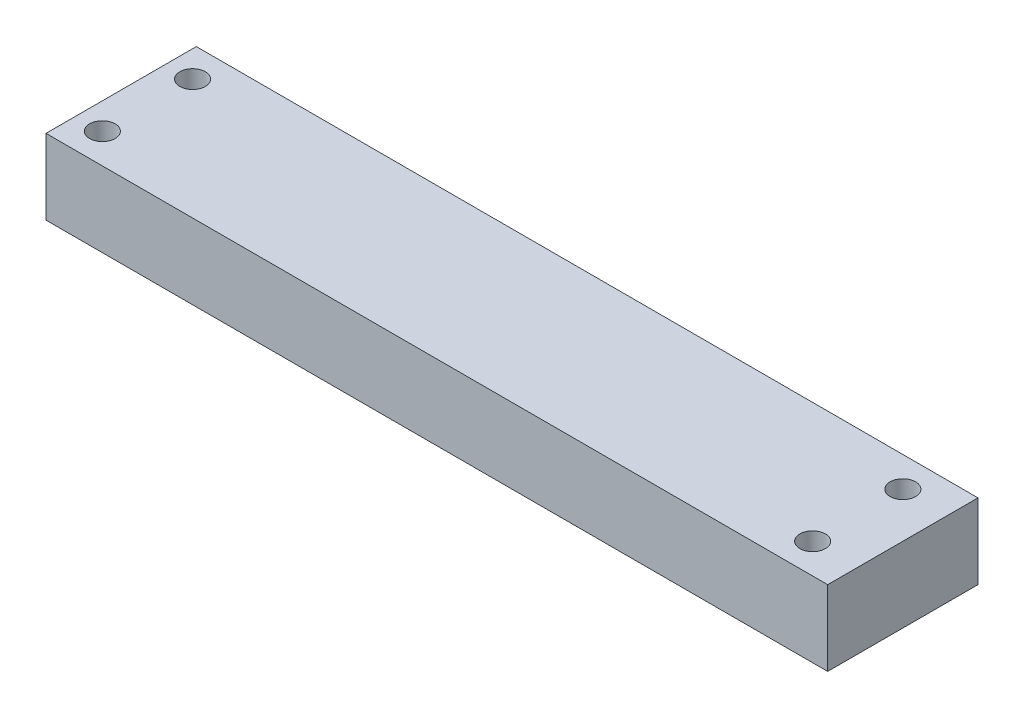
ISO-10303-21;
HEADER;
FILE_DESCRIPTION(('STEP AP214'),'2;1');
FILE_NAME('part.step','',(''),(''),'','','');
FILE_SCHEMA(('AUTOMOTIVE_DESIGN { 1 0 10303 214 1 1 1 1 }'));
ENDSEC;
DATA;
#1=APPLICATION_CONTEXT('core data for automotive mechanical design processes');
#2=APPLICATION_PROTOCOL_DEFINITION('international standard','automotive_design',2000,#1);
#3=PRODUCT_CONTEXT('',#1,'mechanical');
#4=PRODUCT('Part','Part','',(#3));
#5=PRODUCT_RELATED_PRODUCT_CATEGORY('part','',(#4));
#6=PRODUCT_DEFINITION_FORMATION('','',#4);
#7=PRODUCT_DEFINITION_CONTEXT('part definition',#1,'design');
#8=PRODUCT_DEFINITION('design','',#6,#7);
#9=PRODUCT_DEFINITION_SHAPE('','',#8);
#10=(LENGTH_UNIT() NAMED_UNIT(*) SI_UNIT(.MILLI.,.METRE.));
#11=(NAMED_UNIT(*) PLANE_ANGLE_UNIT() SI_UNIT($,.RADIAN.));
#12=(NAMED_UNIT(*) SI_UNIT($,.STERADIAN.) SOLID_ANGLE_UNIT());
#13=UNCERTAINTY_MEASURE_WITH_UNIT(LENGTH_MEASURE(1.E-05),#10,'distance_accuracy_value','');
#14=(GEOMETRIC_REPRESENTATION_CONTEXT(3) GLOBAL_UNCERTAINTY_ASSIGNED_CONTEXT((#13)) GLOBAL_UNIT_ASSIGNED_CONTEXT((#10,
#11,#12)) REPRESENTATION_CONTEXT('',''));
#15=CARTESIAN_POINT('',(0.,0.,0.));
#16=DIRECTION('',(0.,0.,1.));
#17=DIRECTION('',(1.,0.,0.));
#18=AXIS2_PLACEMENT_3D('',#15,#16,#17);
#19=CARTESIAN_POINT('',(-52.,5.,10.));
#20=DIRECTION('',(1.,0.,0.));
#21=DIRECTION('',(0.,0.,-1.));
#22=AXIS2_PLACEMENT_3D('',#19,#20,#21);
#23=PLANE('',#22);
#24=DIRECTION('',(0.,-1.,0.));
#25=VECTOR('',#24,1.);
#26=CARTESIAN_POINT('',(-52.,5.,-10.));
#27=LINE('',#26,#25);
#28=CARTESIAN_POINT('',(-52.,5.,-10.));
#29=VERTEX_POINT('',#28);
#30=CARTESIAN_POINT('',(-52.,-5.,-10.));
#31=VERTEX_POINT('',#30);
#32=EDGE_CURVE('E107',#29,#31,#27,.T.);
#33=ORIENTED_EDGE('',*,*,#32,.T.);
#34=DIRECTION('',(0.,0.,-1.));
#35=VECTOR('',#34,1.);
#36=CARTESIAN_POINT('',(-52.,-5.,10.));
#37=LINE('',#36,#35);
#38=CARTESIAN_POINT('',(-52.,-5.,10.));
#39=VERTEX_POINT('',#38);
#40=EDGE_CURVE('E11',#39,#31,#37,.T.);
#41=ORIENTED_EDGE('',*,*,#40,.F.);
#42=DIRECTION('',(0.,-1.,0.));
#43=VECTOR('',#42,1.);
#44=CARTESIAN_POINT('',(-52.,5.,10.));
#45=LINE('',#44,#43);
#46=CARTESIAN_POINT('',(-52.,5.,10.));
#47=VERTEX_POINT('',#46);
#48=EDGE_CURVE('E94',#47,#39,#45,.T.);
#49=ORIENTED_EDGE('',*,*,#48,.F.);
#50=DIRECTION('',(0.,0.,-1.));
#51=VECTOR('',#50,1.);
#52=CARTESIAN_POINT('',(-52.,5.,10.));
#53=LINE('',#52,#51);
#54=EDGE_CURVE('E103',#47,#29,#53,.T.);
#55=ORIENTED_EDGE('',*,*,#54,.T.);
#56=EDGE_LOOP('',(#33,#41,#49,#55));
#57=FACE_BOUND('',#56,.T.);
#58=ADVANCED_FACE('F41',(#57),#23,.F.);
#59=CARTESIAN_POINT('',(-52.,-5.,10.));
#60=DIRECTION('',(0.,1.,0.));
#61=DIRECTION('',(0.,0.,1.));
#62=AXIS2_PLACEMENT_3D('',#59,#60,#61);
#63=PLANE('',#62);
#64=CARTESIAN_POINT('',(46.,-5.,-6.));
#65=DIRECTION('',(0.,1.,0.));
#66=DIRECTION('',(0.,0.,1.));
#67=AXIS2_PLACEMENT_3D('',#64,#65,#66);
#68=CIRCLE('',#67,1.7);
#69=CARTESIAN_POINT('',(46.,-5.,-4.3));
#70=VERTEX_POINT('',#69);
#71=EDGE_CURVE('E125',#70,#70,#68,.F.);
#72=ORIENTED_EDGE('',*,*,#71,.F.);
#73=EDGE_LOOP('',(#72));
#74=FACE_BOUND('',#73,.T.);
#75=CARTESIAN_POINT('',(46.,-5.,6.));
#76=DIRECTION('',(0.,1.,0.));
#77=DIRECTION('',(0.,0.,1.));
#78=AXIS2_PLACEMENT_3D('',#75,#76,#77);
#79=CIRCLE('',#78,1.7);
#80=CARTESIAN_POINT('',(46.,-5.,7.7));
#81=VERTEX_POINT('',#80);
#82=EDGE_CURVE('E122',#81,#81,#79,.F.);
#83=ORIENTED_EDGE('',*,*,#82,.F.);
#84=EDGE_LOOP('',(#83));
#85=FACE_BOUND('',#84,.T.);
#86=CARTESIAN_POINT('',(-48.5,-5.,-6.));
#87=DIRECTION('',(0.,1.,0.));
#88=DIRECTION('',(0.,0.,1.));
#89=AXIS2_PLACEMENT_3D('',#86,#87,#88);
#90=CIRCLE('',#89,1.7);
#91=CARTESIAN_POINT('',(-48.5,-5.,-4.3));
#92=VERTEX_POINT('',#91);
#93=EDGE_CURVE('E119',#92,#92,#90,.F.);
#94=ORIENTED_EDGE('',*,*,#93,.F.);
#95=EDGE_LOOP('',(#94));
#96=FACE_BOUND('',#95,.T.);
#97=CARTESIAN_POINT('',(-48.5,-5.,6.));
#98=DIRECTION('',(0.,1.,0.));
#99=DIRECTION('',(0.,0.,1.));
#100=AXIS2_PLACEMENT_3D('',#97,#98,#99);
#101=CIRCLE('',#100,1.7);
#102=CARTESIAN_POINT('',(-48.5,-5.,7.7));
#103=VERTEX_POINT('',#102);
#104=EDGE_CURVE('E110',#103,#103,#101,.F.);
#105=ORIENTED_EDGE('',*,*,#104,.F.);
#106=EDGE_LOOP('',(#105));
#107=FACE_BOUND('',#106,.T.);
#108=DIRECTION('',(1.,0.,0.));
#109=VECTOR('',#108,1.);
#110=CARTESIAN_POINT('',(-52.,-5.,-10.));
#111=LINE('',#110,#109);
#112=CARTESIAN_POINT('',(52.,-5.,-10.));
#113=VERTEX_POINT('',#112);
#114=EDGE_CURVE('E98',#31,#113,#111,.T.);
#115=ORIENTED_EDGE('',*,*,#114,.T.);
#116=DIRECTION('',(0.,0.,-1.));
#117=VECTOR('',#116,1.);
#118=CARTESIAN_POINT('',(52.,-5.,10.));
#119=LINE('',#118,#117);
#120=CARTESIAN_POINT('',(52.,-5.,10.));
#121=VERTEX_POINT('',#120);
#122=EDGE_CURVE('E50',#121,#113,#119,.T.);
#123=ORIENTED_EDGE('',*,*,#122,.F.);
#124=DIRECTION('',(1.,0.,0.));
#125=VECTOR('',#124,1.);
#126=CARTESIAN_POINT('',(-52.,-5.,10.));
#127=LINE('',#126,#125);
#128=EDGE_CURVE('E89',#39,#121,#127,.T.);
#129=ORIENTED_EDGE('',*,*,#128,.F.);
#130=ORIENTED_EDGE('',*,*,#40,.T.);
#131=EDGE_LOOP('',(#115,#123,#129,#130));
#132=FACE_BOUND('',#131,.T.);
#133=ADVANCED_FACE('F97',(#74,#85,#96,#107,#132),#63,.F.);
#134=CARTESIAN_POINT('',(52.,-5.,10.));
#135=DIRECTION('',(-1.,0.,0.));
#136=DIRECTION('',(0.,0.,1.));
#137=AXIS2_PLACEMENT_3D('',#134,#135,#136);
#138=PLANE('',#137);
#139=DIRECTION('',(0.,1.,0.));
#140=VECTOR('',#139,1.);
#141=CARTESIAN_POINT('',(52.,-5.,-10.));
#142=LINE('',#141,#140);
#143=CARTESIAN_POINT('',(52.,5.,-10.));
#144=VERTEX_POINT('',#143);
#145=EDGE_CURVE('E76',#113,#144,#142,.T.);
#146=ORIENTED_EDGE('',*,*,#145,.T.);
#147=DIRECTION('',(0.,0.,-1.));
#148=VECTOR('',#147,1.);
#149=CARTESIAN_POINT('',(52.,5.,10.));
#150=LINE('',#149,#148);
#151=CARTESIAN_POINT('',(52.,5.,10.));
#152=VERTEX_POINT('',#151);
#153=EDGE_CURVE('E99',#152,#144,#150,.T.);
#154=ORIENTED_EDGE('',*,*,#153,.F.);
#155=DIRECTION('',(0.,1.,0.));
#156=VECTOR('',#155,1.);
#157=CARTESIAN_POINT('',(52.,-5.,10.));
#158=LINE('',#157,#156);
#159=EDGE_CURVE('E92',#121,#152,#158,.T.);
#160=ORIENTED_EDGE('',*,*,#159,.F.);
#161=ORIENTED_EDGE('',*,*,#122,.T.);
#162=EDGE_LOOP('',(#146,#154,#160,#161));
#163=FACE_BOUND('',#162,.T.);
#164=ADVANCED_FACE('F101',(#163),#138,.F.);
#165=CARTESIAN_POINT('',(52.,5.,10.));
#166=DIRECTION('',(0.,-1.,0.));
#167=DIRECTION('',(0.,0.,-1.));
#168=AXIS2_PLACEMENT_3D('',#165,#166,#167);
#169=PLANE('',#168);
#170=CARTESIAN_POINT('',(46.,5.,-6.));
#171=DIRECTION('',(0.,-1.,0.));
#172=DIRECTION('',(0.,0.,-1.));
#173=AXIS2_PLACEMENT_3D('',#170,#171,#172);
#174=CIRCLE('',#173,1.7);
#175=CARTESIAN_POINT('',(46.,5.,-7.7));
#176=VERTEX_POINT('',#175);
#177=EDGE_CURVE('E44',#176,#176,#174,.F.);
#178=ORIENTED_EDGE('',*,*,#177,.F.);
#179=EDGE_LOOP('',(#178));
#180=FACE_BOUND('',#179,.T.);
#181=CARTESIAN_POINT('',(46.,5.,6.));
#182=DIRECTION('',(0.,-1.,0.));
#183=DIRECTION('',(0.,0.,-1.));
#184=AXIS2_PLACEMENT_3D('',#181,#182,#183);
#185=CIRCLE('',#184,1.7);
#186=CARTESIAN_POINT('',(46.,5.,4.3));
#187=VERTEX_POINT('',#186);
#188=EDGE_CURVE('E123',#187,#187,#185,.F.);
#189=ORIENTED_EDGE('',*,*,#188,.F.);
#190=EDGE_LOOP('',(#189));
#191=FACE_BOUND('',#190,.T.);
#192=CARTESIAN_POINT('',(-48.5,5.,-6.));
#193=DIRECTION('',(0.,-1.,0.));
#194=DIRECTION('',(0.,0.,-1.));
#195=AXIS2_PLACEMENT_3D('',#192,#193,#194);
#196=CIRCLE('',#195,1.7);
#197=CARTESIAN_POINT('',(-48.5,5.,-7.7));
#198=VERTEX_POINT('',#197);
#199=EDGE_CURVE('E120',#198,#198,#196,.F.);
#200=ORIENTED_EDGE('',*,*,#199,.F.);
#201=EDGE_LOOP('',(#200));
#202=FACE_BOUND('',#201,.T.);
#203=CARTESIAN_POINT('',(-48.5,5.,6.));
#204=DIRECTION('',(0.,-1.,0.));
#205=DIRECTION('',(0.,0.,-1.));
#206=AXIS2_PLACEMENT_3D('',#203,#204,#205);
#207=CIRCLE('',#206,1.7);
#208=CARTESIAN_POINT('',(-48.5,5.,4.3));
#209=VERTEX_POINT('',#208);
#210=EDGE_CURVE('E116',#209,#209,#207,.F.);
#211=ORIENTED_EDGE('',*,*,#210,.F.);
#212=EDGE_LOOP('',(#211));
#213=FACE_BOUND('',#212,.T.);
#214=DIRECTION('',(-1.,0.,0.));
#215=VECTOR('',#214,1.);
#216=CARTESIAN_POINT('',(52.,5.,-10.));
#217=LINE('',#216,#215);
#218=EDGE_CURVE('E82',#144,#29,#217,.T.);
#219=ORIENTED_EDGE('',*,*,#218,.T.);
#220=ORIENTED_EDGE('',*,*,#54,.F.);
#221=DIRECTION('',(-1.,0.,0.));
#222=VECTOR('',#221,1.);
#223=CARTESIAN_POINT('',(52.,5.,10.));
#224=LINE('',#223,#222);
#225=EDGE_CURVE('E59',#152,#47,#224,.T.);
#226=ORIENTED_EDGE('',*,*,#225,.F.);
#227=ORIENTED_EDGE('',*,*,#153,.T.);
#228=EDGE_LOOP('',(#219,#220,#226,#227));
#229=FACE_BOUND('',#228,.T.);
#230=ADVANCED_FACE('F149',(#180,#191,#202,#213,#229),#169,.F.);
#231=CARTESIAN_POINT('',(-52.,-5.,10.));
#232=DIRECTION('',(0.,0.,1.));
#233=DIRECTION('',(1.,0.,0.));
#234=AXIS2_PLACEMENT_3D('',#231,#232,#233);
#235=PLANE('',#234);
#236=ORIENTED_EDGE('',*,*,#48,.T.);
#237=ORIENTED_EDGE('',*,*,#128,.T.);
#238=ORIENTED_EDGE('',*,*,#159,.T.);
#239=ORIENTED_EDGE('',*,*,#225,.T.);
#240=EDGE_LOOP('',(#236,#237,#238,#239));
#241=FACE_BOUND('',#240,.T.);
#242=ADVANCED_FACE('F90',(#241),#235,.T.);
#243=CARTESIAN_POINT('',(-52.,-5.,-10.));
#244=DIRECTION('',(0.,0.,1.));
#245=DIRECTION('',(1.,0.,0.));
#246=AXIS2_PLACEMENT_3D('',#243,#244,#245);
#247=PLANE('',#246);
#248=ORIENTED_EDGE('',*,*,#32,.F.);
#249=ORIENTED_EDGE('',*,*,#218,.F.);
#250=ORIENTED_EDGE('',*,*,#145,.F.);
#251=ORIENTED_EDGE('',*,*,#114,.F.);
#252=EDGE_LOOP('',(#248,#249,#250,#251));
#253=FACE_BOUND('',#252,.T.);
#254=ADVANCED_FACE('F157',(#253),#247,.F.);
#255=CARTESIAN_POINT('',(-48.5,-10.,6.));
#256=DIRECTION('',(0.,1.,0.));
#257=DIRECTION('',(-1.,0.,0.));
#258=AXIS2_PLACEMENT_3D('',#255,#256,#257);
#259=CYLINDRICAL_SURFACE('',#258,1.7);
#260=ORIENTED_EDGE('',*,*,#210,.T.);
#261=EDGE_LOOP('',(#260));
#262=FACE_BOUND('',#261,.T.);
#263=ORIENTED_EDGE('',*,*,#104,.T.);
#264=EDGE_LOOP('',(#263));
#265=FACE_BOUND('',#264,.T.);
#266=ADVANCED_FACE('F141',(#262,#265),#259,.F.);
#267=CARTESIAN_POINT('',(-48.5,-10.,-6.));
#268=DIRECTION('',(0.,1.,0.));
#269=DIRECTION('',(-1.,0.,0.));
#270=AXIS2_PLACEMENT_3D('',#267,#268,#269);
#271=CYLINDRICAL_SURFACE('',#270,1.7);
#272=ORIENTED_EDGE('',*,*,#199,.T.);
#273=EDGE_LOOP('',(#272));
#274=FACE_BOUND('',#273,.T.);
#275=ORIENTED_EDGE('',*,*,#93,.T.);
#276=EDGE_LOOP('',(#275));
#277=FACE_BOUND('',#276,.T.);
#278=ADVANCED_FACE('F165',(#274,#277),#271,.F.);
#279=CARTESIAN_POINT('',(46.,-10.,6.));
#280=DIRECTION('',(0.,1.,0.));
#281=DIRECTION('',(-1.,0.,0.));
#282=AXIS2_PLACEMENT_3D('',#279,#280,#281);
#283=CYLINDRICAL_SURFACE('',#282,1.7);
#284=ORIENTED_EDGE('',*,*,#188,.T.);
#285=EDGE_LOOP('',(#284));
#286=FACE_BOUND('',#285,.T.);
#287=ORIENTED_EDGE('',*,*,#82,.T.);
#288=EDGE_LOOP('',(#287));
#289=FACE_BOUND('',#288,.T.);
#290=ADVANCED_FACE('F169',(#286,#289),#283,.F.);
#291=CARTESIAN_POINT('',(46.,-10.,-6.));
#292=DIRECTION('',(0.,1.,0.));
#293=DIRECTION('',(-1.,0.,0.));
#294=AXIS2_PLACEMENT_3D('',#291,#292,#293);
#295=CYLINDRICAL_SURFACE('',#294,1.7);
#296=ORIENTED_EDGE('',*,*,#177,.T.);
#297=EDGE_LOOP('',(#296));
#298=FACE_BOUND('',#297,.T.);
#299=ORIENTED_EDGE('',*,*,#71,.T.);
#300=EDGE_LOOP('',(#299));
#301=FACE_BOUND('',#300,.T.);
#302=ADVANCED_FACE('F173',(#298,#301),#295,.F.);
#303=CLOSED_SHELL('',(#58,#133,#164,#230,#242,#254,#266,#278,#290,#302));
#304=MANIFOLD_SOLID_BREP('B2',#303);
#305=ADVANCED_BREP_SHAPE_REPRESENTATION('',(#18,#304),#14);
#306=SHAPE_DEFINITION_REPRESENTATION(#9,#305);
ENDSEC;
END-ISO-10303-21;
